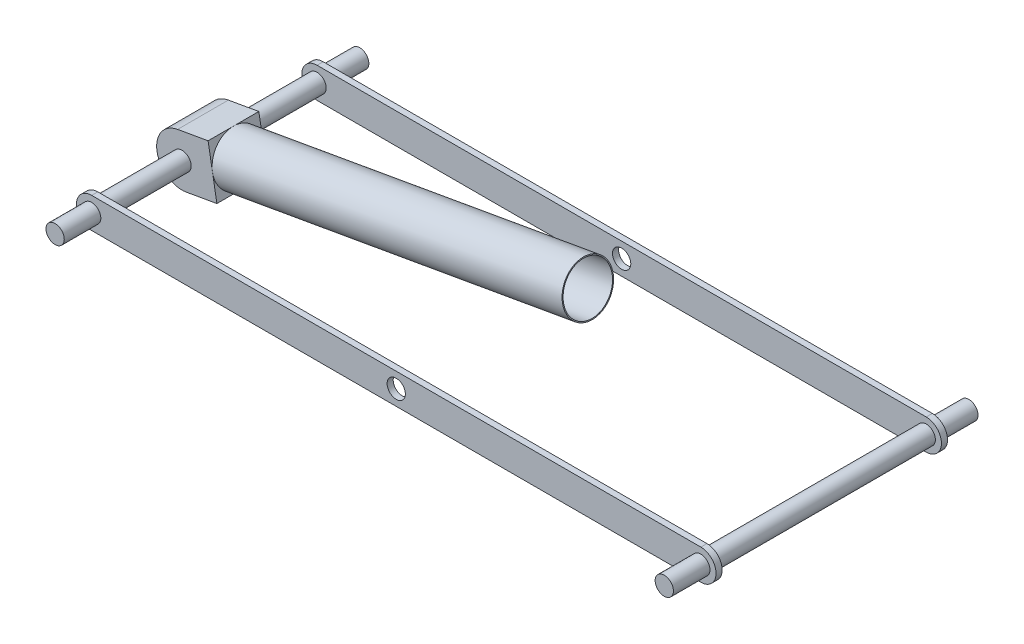
ISO-10303-21;
HEADER;
FILE_DESCRIPTION(('STEP AP214'),'2;1');
FILE_NAME('part.step','',(''),(''),'','','');
FILE_SCHEMA(('AUTOMOTIVE_DESIGN { 1 0 10303 214 1 1 1 1 }'));
ENDSEC;
DATA;
#1=APPLICATION_CONTEXT('core data for automotive mechanical design processes');
#2=APPLICATION_PROTOCOL_DEFINITION('international standard','automotive_design',2000,#1);
#3=PRODUCT_CONTEXT('',#1,'mechanical');
#4=PRODUCT('Part','Part','',(#3));
#5=PRODUCT_RELATED_PRODUCT_CATEGORY('part','',(#4));
#6=PRODUCT_DEFINITION_FORMATION('','',#4);
#7=PRODUCT_DEFINITION_CONTEXT('part definition',#1,'design');
#8=PRODUCT_DEFINITION('design','',#6,#7);
#9=PRODUCT_DEFINITION_SHAPE('','',#8);
#10=(LENGTH_UNIT() NAMED_UNIT(*) SI_UNIT(.MILLI.,.METRE.));
#11=(NAMED_UNIT(*) PLANE_ANGLE_UNIT() SI_UNIT($,.RADIAN.));
#12=(NAMED_UNIT(*) SI_UNIT($,.STERADIAN.) SOLID_ANGLE_UNIT());
#13=UNCERTAINTY_MEASURE_WITH_UNIT(LENGTH_MEASURE(1.E-05),#10,'distance_accuracy_value','');
#14=(GEOMETRIC_REPRESENTATION_CONTEXT(3) GLOBAL_UNCERTAINTY_ASSIGNED_CONTEXT((#13)) GLOBAL_UNIT_ASSIGNED_CONTEXT((#10,
#11,#12)) REPRESENTATION_CONTEXT('',''));
#15=CARTESIAN_POINT('',(0.,0.,0.));
#16=DIRECTION('',(0.,0.,1.));
#17=DIRECTION('',(1.,0.,0.));
#18=AXIS2_PLACEMENT_3D('',#15,#16,#17);
#19=CARTESIAN_POINT('',(0.,0.,114.));
#20=DIRECTION('',(0.,0.,-1.));
#21=DIRECTION('',(-1.,0.,0.));
#22=AXIS2_PLACEMENT_3D('',#19,#20,#21);
#23=CYLINDRICAL_SURFACE('',#22,15.);
#24=CARTESIAN_POINT('',(0.,0.,108.));
#25=DIRECTION('',(0.,0.,1.));
#26=DIRECTION('',(1.,0.,0.));
#27=AXIS2_PLACEMENT_3D('',#24,#25,#26);
#28=CIRCLE('',#27,15.);
#29=CARTESIAN_POINT('',(0.,15.,108.));
#30=VERTEX_POINT('',#29);
#31=CARTESIAN_POINT('',(0.,-15.,108.));
#32=VERTEX_POINT('',#31);
#33=EDGE_CURVE('E118',#30,#32,#28,.T.);
#34=ORIENTED_EDGE('',*,*,#33,.T.);
#35=DIRECTION('',(0.,0.,-1.));
#36=VECTOR('',#35,1.);
#37=CARTESIAN_POINT('',(0.,-15.,114.));
#38=LINE('',#37,#36);
#39=CARTESIAN_POINT('',(0.,-15.,114.));
#40=VERTEX_POINT('',#39);
#41=EDGE_CURVE('E12',#40,#32,#38,.T.);
#42=ORIENTED_EDGE('',*,*,#41,.F.);
#43=CARTESIAN_POINT('',(0.,0.,114.));
#44=DIRECTION('',(0.,0.,1.));
#45=DIRECTION('',(1.,0.,0.));
#46=AXIS2_PLACEMENT_3D('',#43,#44,#45);
#47=CIRCLE('',#46,15.);
#48=CARTESIAN_POINT('',(0.,15.,114.));
#49=VERTEX_POINT('',#48);
#50=EDGE_CURVE('E106',#49,#40,#47,.T.);
#51=ORIENTED_EDGE('',*,*,#50,.F.);
#52=DIRECTION('',(0.,0.,-1.));
#53=VECTOR('',#52,1.);
#54=CARTESIAN_POINT('',(0.,15.,114.));
#55=LINE('',#54,#53);
#56=EDGE_CURVE('E114',#49,#30,#55,.T.);
#57=ORIENTED_EDGE('',*,*,#56,.T.);
#58=EDGE_LOOP('',(#34,#42,#51,#57));
#59=FACE_BOUND('',#58,.T.);
#60=ADVANCED_FACE('F53',(#59),#23,.T.);
#61=CARTESIAN_POINT('',(600.,-15.,114.));
#62=DIRECTION('',(0.,1.,0.));
#63=DIRECTION('',(0.,0.,1.));
#64=AXIS2_PLACEMENT_3D('',#61,#62,#63);
#65=PLANE('',#64);
#66=DIRECTION('',(1.,0.,0.));
#67=VECTOR('',#66,1.);
#68=CARTESIAN_POINT('',(600.,-15.,108.));
#69=LINE('',#68,#67);
#70=CARTESIAN_POINT('',(600.,-15.,108.));
#71=VERTEX_POINT('',#70);
#72=EDGE_CURVE('E109',#32,#71,#69,.T.);
#73=ORIENTED_EDGE('',*,*,#72,.T.);
#74=DIRECTION('',(0.,0.,-1.));
#75=VECTOR('',#74,1.);
#76=CARTESIAN_POINT('',(600.,-15.,114.));
#77=LINE('',#76,#75);
#78=CARTESIAN_POINT('',(600.,-15.,114.));
#79=VERTEX_POINT('',#78);
#80=EDGE_CURVE('E64',#79,#71,#77,.T.);
#81=ORIENTED_EDGE('',*,*,#80,.F.);
#82=DIRECTION('',(1.,0.,0.));
#83=VECTOR('',#82,1.);
#84=CARTESIAN_POINT('',(600.,-15.,114.));
#85=LINE('',#84,#83);
#86=EDGE_CURVE('E103',#40,#79,#85,.T.);
#87=ORIENTED_EDGE('',*,*,#86,.F.);
#88=ORIENTED_EDGE('',*,*,#41,.T.);
#89=EDGE_LOOP('',(#73,#81,#87,#88));
#90=FACE_BOUND('',#89,.T.);
#91=ADVANCED_FACE('F107',(#90),#65,.F.);
#92=CARTESIAN_POINT('',(600.,0.,114.));
#93=DIRECTION('',(0.,0.,-1.));
#94=DIRECTION('',(-1.,0.,0.));
#95=AXIS2_PLACEMENT_3D('',#92,#93,#94);
#96=CYLINDRICAL_SURFACE('',#95,15.);
#97=CARTESIAN_POINT('',(600.,0.,108.));
#98=DIRECTION('',(0.,0.,1.));
#99=DIRECTION('',(1.,0.,0.));
#100=AXIS2_PLACEMENT_3D('',#97,#98,#99);
#101=CIRCLE('',#100,15.);
#102=CARTESIAN_POINT('',(600.,15.,108.));
#103=VERTEX_POINT('',#102);
#104=EDGE_CURVE('E89',#71,#103,#101,.T.);
#105=ORIENTED_EDGE('',*,*,#104,.T.);
#106=DIRECTION('',(0.,0.,-1.));
#107=VECTOR('',#106,1.);
#108=CARTESIAN_POINT('',(600.,15.,114.));
#109=LINE('',#108,#107);
#110=CARTESIAN_POINT('',(600.,15.,114.));
#111=VERTEX_POINT('',#110);
#112=EDGE_CURVE('E111',#111,#103,#109,.T.);
#113=ORIENTED_EDGE('',*,*,#112,.F.);
#114=CARTESIAN_POINT('',(600.,0.,114.));
#115=DIRECTION('',(0.,0.,1.));
#116=DIRECTION('',(1.,0.,0.));
#117=AXIS2_PLACEMENT_3D('',#114,#115,#116);
#118=CIRCLE('',#117,15.);
#119=EDGE_CURVE('E104',#79,#111,#118,.T.);
#120=ORIENTED_EDGE('',*,*,#119,.F.);
#121=ORIENTED_EDGE('',*,*,#80,.T.);
#122=EDGE_LOOP('',(#105,#113,#120,#121));
#123=FACE_BOUND('',#122,.T.);
#124=ADVANCED_FACE('F113',(#123),#96,.T.);
#125=CARTESIAN_POINT('',(0.,15.,114.));
#126=DIRECTION('',(0.,-1.,0.));
#127=DIRECTION('',(1.,0.,0.));
#128=AXIS2_PLACEMENT_3D('',#125,#126,#127);
#129=PLANE('',#128);
#130=DIRECTION('',(-1.,0.,0.));
#131=VECTOR('',#130,1.);
#132=CARTESIAN_POINT('',(0.,15.,108.));
#133=LINE('',#132,#131);
#134=EDGE_CURVE('E93',#103,#30,#133,.T.);
#135=ORIENTED_EDGE('',*,*,#134,.T.);
#136=ORIENTED_EDGE('',*,*,#56,.F.);
#137=DIRECTION('',(-1.,0.,0.));
#138=VECTOR('',#137,1.);
#139=CARTESIAN_POINT('',(0.,15.,114.));
#140=LINE('',#139,#138);
#141=EDGE_CURVE('E71',#111,#49,#140,.T.);
#142=ORIENTED_EDGE('',*,*,#141,.F.);
#143=ORIENTED_EDGE('',*,*,#112,.T.);
#144=EDGE_LOOP('',(#135,#136,#142,#143));
#145=FACE_BOUND('',#144,.T.);
#146=ADVANCED_FACE('F130',(#145),#129,.F.);
#147=CARTESIAN_POINT('',(0.,0.,114.));
#148=DIRECTION('',(0.,0.,1.));
#149=DIRECTION('',(1.,0.,0.));
#150=AXIS2_PLACEMENT_3D('',#147,#148,#149);
#151=PLANE('',#150);
#152=CARTESIAN_POINT('',(300.,0.,114.));
#153=DIRECTION('',(0.,0.,1.));
#154=DIRECTION('',(1.,0.,0.));
#155=AXIS2_PLACEMENT_3D('',#152,#153,#154);
#156=CIRCLE('',#155,9.00000000000001);
#157=CARTESIAN_POINT('',(309.,0.,114.));
#158=VERTEX_POINT('',#157);
#159=EDGE_CURVE('E125',#158,#158,#156,.T.);
#160=ORIENTED_EDGE('',*,*,#159,.F.);
#161=EDGE_LOOP('',(#160));
#162=FACE_BOUND('',#161,.T.);
#163=ORIENTED_EDGE('',*,*,#50,.T.);
#164=ORIENTED_EDGE('',*,*,#86,.T.);
#165=ORIENTED_EDGE('',*,*,#119,.T.);
#166=ORIENTED_EDGE('',*,*,#141,.T.);
#167=EDGE_LOOP('',(#163,#164,#165,#166));
#168=FACE_BOUND('',#167,.T.);
#169=ADVANCED_FACE('F105',(#162,#168),#151,.T.);
#170=CARTESIAN_POINT('',(0.,0.,108.));
#171=DIRECTION('',(0.,0.,1.));
#172=DIRECTION('',(1.,0.,0.));
#173=AXIS2_PLACEMENT_3D('',#170,#171,#172);
#174=PLANE('',#173);
#175=CARTESIAN_POINT('',(300.,0.,108.));
#176=DIRECTION('',(0.,0.,1.));
#177=DIRECTION('',(1.,0.,0.));
#178=AXIS2_PLACEMENT_3D('',#175,#176,#177);
#179=CIRCLE('',#178,9.00000000000001);
#180=CARTESIAN_POINT('',(309.,0.,108.));
#181=VERTEX_POINT('',#180);
#182=EDGE_CURVE('E60',#181,#181,#179,.T.);
#183=ORIENTED_EDGE('',*,*,#182,.T.);
#184=EDGE_LOOP('',(#183));
#185=FACE_BOUND('',#184,.T.);
#186=ORIENTED_EDGE('',*,*,#33,.F.);
#187=ORIENTED_EDGE('',*,*,#134,.F.);
#188=ORIENTED_EDGE('',*,*,#104,.F.);
#189=ORIENTED_EDGE('',*,*,#72,.F.);
#190=EDGE_LOOP('',(#186,#187,#188,#189));
#191=FACE_BOUND('',#190,.T.);
#192=ADVANCED_FACE('F128',(#185,#191),#174,.F.);
#193=CARTESIAN_POINT('',(300.,0.,-150.));
#194=DIRECTION('',(0.,0.,1.));
#195=DIRECTION('',(1.,0.,0.));
#196=AXIS2_PLACEMENT_3D('',#193,#194,#195);
#197=CYLINDRICAL_SURFACE('',#196,9.00000000000001);
#198=ORIENTED_EDGE('',*,*,#159,.T.);
#199=EDGE_LOOP('',(#198));
#200=FACE_BOUND('',#199,.T.);
#201=ORIENTED_EDGE('',*,*,#182,.F.);
#202=EDGE_LOOP('',(#201));
#203=FACE_BOUND('',#202,.T.);
#204=ADVANCED_FACE('F140',(#200,#203),#197,.F.);
#205=CLOSED_SHELL('',(#60,#91,#124,#146,#169,#192,#204));
#206=MANIFOLD_SOLID_BREP('B2',#205);
#207=CARTESIAN_POINT('',(0.,0.,150.));
#208=DIRECTION('',(0.,0.,-1.));
#209=DIRECTION('',(-1.,0.,0.));
#210=AXIS2_PLACEMENT_3D('',#207,#208,#209);
#211=CYLINDRICAL_SURFACE('',#210,9.);
#212=CARTESIAN_POINT('',(0.,0.,150.));
#213=DIRECTION('',(0.,0.,1.));
#214=DIRECTION('',(1.,0.,0.));
#215=AXIS2_PLACEMENT_3D('',#212,#213,#214);
#216=CIRCLE('',#215,9.);
#217=CARTESIAN_POINT('',(9.,0.,150.));
#218=VERTEX_POINT('',#217);
#219=EDGE_CURVE('E52',#218,#218,#216,.T.);
#220=ORIENTED_EDGE('',*,*,#219,.F.);
#221=EDGE_LOOP('',(#220));
#222=FACE_BOUND('',#221,.T.);
#223=CARTESIAN_POINT('',(0.,0.,-150.));
#224=DIRECTION('',(0.,0.,1.));
#225=DIRECTION('',(1.,0.,0.));
#226=AXIS2_PLACEMENT_3D('',#223,#224,#225);
#227=CIRCLE('',#226,9.);
#228=CARTESIAN_POINT('',(9.,0.,-150.));
#229=VERTEX_POINT('',#228);
#230=EDGE_CURVE('E222',#229,#229,#227,.T.);
#231=ORIENTED_EDGE('',*,*,#230,.T.);
#232=EDGE_LOOP('',(#231));
#233=FACE_BOUND('',#232,.T.);
#234=ADVANCED_FACE('F216',(#222,#233),#211,.T.);
#235=CARTESIAN_POINT('',(0.,0.,150.));
#236=DIRECTION('',(0.,0.,1.));
#237=DIRECTION('',(1.,0.,0.));
#238=AXIS2_PLACEMENT_3D('',#235,#236,#237);
#239=PLANE('',#238);
#240=ORIENTED_EDGE('',*,*,#219,.T.);
#241=EDGE_LOOP('',(#240));
#242=FACE_BOUND('',#241,.T.);
#243=ADVANCED_FACE('F234',(#242),#239,.T.);
#244=CARTESIAN_POINT('',(0.,0.,-150.));
#245=DIRECTION('',(0.,0.,1.));
#246=DIRECTION('',(1.,0.,0.));
#247=AXIS2_PLACEMENT_3D('',#244,#245,#246);
#248=PLANE('',#247);
#249=ORIENTED_EDGE('',*,*,#230,.F.);
#250=EDGE_LOOP('',(#249));
#251=FACE_BOUND('',#250,.T.);
#252=ADVANCED_FACE('F235',(#251),#248,.F.);
#253=CLOSED_SHELL('',(#234,#243,#252));
#254=MANIFOLD_SOLID_BREP('B6',#253);
#255=CARTESIAN_POINT('',(0.,0.,-114.));
#256=DIRECTION('',(0.,0.,1.));
#257=DIRECTION('',(-1.,0.,0.));
#258=AXIS2_PLACEMENT_3D('',#255,#256,#257);
#259=CYLINDRICAL_SURFACE('',#258,15.);
#260=CARTESIAN_POINT('',(0.,0.,-108.));
#261=DIRECTION('',(0.,0.,1.));
#262=DIRECTION('',(1.,0.,0.));
#263=AXIS2_PLACEMENT_3D('',#260,#261,#262);
#264=CIRCLE('',#263,15.);
#265=CARTESIAN_POINT('',(0.,15.,-108.));
#266=VERTEX_POINT('',#265);
#267=CARTESIAN_POINT('',(0.,-15.,-108.));
#268=VERTEX_POINT('',#267);
#269=EDGE_CURVE('E333',#266,#268,#264,.T.);
#270=ORIENTED_EDGE('',*,*,#269,.F.);
#271=DIRECTION('',(0.,0.,1.));
#272=VECTOR('',#271,1.);
#273=CARTESIAN_POINT('',(0.,15.,-114.));
#274=LINE('',#273,#272);
#275=CARTESIAN_POINT('',(0.,15.,-114.));
#276=VERTEX_POINT('',#275);
#277=EDGE_CURVE('E334',#276,#266,#274,.T.);
#278=ORIENTED_EDGE('',*,*,#277,.F.);
#279=CARTESIAN_POINT('',(0.,0.,-114.));
#280=DIRECTION('',(0.,0.,1.));
#281=DIRECTION('',(1.,0.,0.));
#282=AXIS2_PLACEMENT_3D('',#279,#280,#281);
#283=CIRCLE('',#282,15.);
#284=CARTESIAN_POINT('',(0.,-15.,-114.));
#285=VERTEX_POINT('',#284);
#286=EDGE_CURVE('E330',#276,#285,#283,.T.);
#287=ORIENTED_EDGE('',*,*,#286,.T.);
#288=DIRECTION('',(0.,0.,1.));
#289=VECTOR('',#288,1.);
#290=CARTESIAN_POINT('',(0.,-15.,-114.));
#291=LINE('',#290,#289);
#292=EDGE_CURVE('E220',#285,#268,#291,.T.);
#293=ORIENTED_EDGE('',*,*,#292,.T.);
#294=EDGE_LOOP('',(#270,#278,#287,#293));
#295=FACE_BOUND('',#294,.T.);
#296=ADVANCED_FACE('F269',(#295),#259,.T.);
#297=CARTESIAN_POINT('',(600.,-15.,-114.));
#298=DIRECTION('',(0.,1.,0.));
#299=DIRECTION('',(0.,0.,-1.));
#300=AXIS2_PLACEMENT_3D('',#297,#298,#299);
#301=PLANE('',#300);
#302=DIRECTION('',(1.,0.,0.));
#303=VECTOR('',#302,1.);
#304=CARTESIAN_POINT('',(600.,-15.,-108.));
#305=LINE('',#304,#303);
#306=CARTESIAN_POINT('',(600.,-15.,-108.));
#307=VERTEX_POINT('',#306);
#308=EDGE_CURVE('E337',#268,#307,#305,.T.);
#309=ORIENTED_EDGE('',*,*,#308,.F.);
#310=ORIENTED_EDGE('',*,*,#292,.F.);
#311=DIRECTION('',(1.,0.,0.));
#312=VECTOR('',#311,1.);
#313=CARTESIAN_POINT('',(600.,-15.,-114.));
#314=LINE('',#313,#312);
#315=CARTESIAN_POINT('',(600.,-15.,-114.));
#316=VERTEX_POINT('',#315);
#317=EDGE_CURVE('E309',#285,#316,#314,.T.);
#318=ORIENTED_EDGE('',*,*,#317,.T.);
#319=DIRECTION('',(0.,0.,1.));
#320=VECTOR('',#319,1.);
#321=CARTESIAN_POINT('',(600.,-15.,-114.));
#322=LINE('',#321,#320);
#323=EDGE_CURVE('E280',#316,#307,#322,.T.);
#324=ORIENTED_EDGE('',*,*,#323,.T.);
#325=EDGE_LOOP('',(#309,#310,#318,#324));
#326=FACE_BOUND('',#325,.T.);
#327=ADVANCED_FACE('F323',(#326),#301,.F.);
#328=CARTESIAN_POINT('',(600.,0.,-114.));
#329=DIRECTION('',(0.,0.,1.));
#330=DIRECTION('',(-1.,0.,0.));
#331=AXIS2_PLACEMENT_3D('',#328,#329,#330);
#332=CYLINDRICAL_SURFACE('',#331,15.);
#333=CARTESIAN_POINT('',(600.,0.,-108.));
#334=DIRECTION('',(0.,0.,1.));
#335=DIRECTION('',(1.,0.,0.));
#336=AXIS2_PLACEMENT_3D('',#333,#334,#335);
#337=CIRCLE('',#336,15.);
#338=CARTESIAN_POINT('',(600.,15.,-108.));
#339=VERTEX_POINT('',#338);
#340=EDGE_CURVE('E318',#307,#339,#337,.T.);
#341=ORIENTED_EDGE('',*,*,#340,.F.);
#342=ORIENTED_EDGE('',*,*,#323,.F.);
#343=CARTESIAN_POINT('',(600.,0.,-114.));
#344=DIRECTION('',(0.,0.,1.));
#345=DIRECTION('',(1.,0.,0.));
#346=AXIS2_PLACEMENT_3D('',#343,#344,#345);
#347=CIRCLE('',#346,15.);
#348=CARTESIAN_POINT('',(600.,15.,-114.));
#349=VERTEX_POINT('',#348);
#350=EDGE_CURVE('E312',#316,#349,#347,.T.);
#351=ORIENTED_EDGE('',*,*,#350,.T.);
#352=DIRECTION('',(0.,0.,1.));
#353=VECTOR('',#352,1.);
#354=CARTESIAN_POINT('',(600.,15.,-114.));
#355=LINE('',#354,#353);
#356=EDGE_CURVE('E324',#349,#339,#355,.T.);
#357=ORIENTED_EDGE('',*,*,#356,.T.);
#358=EDGE_LOOP('',(#341,#342,#351,#357));
#359=FACE_BOUND('',#358,.T.);
#360=ADVANCED_FACE('F316',(#359),#332,.T.);
#361=CARTESIAN_POINT('',(0.,15.,-114.));
#362=DIRECTION('',(0.,-1.,0.));
#363=DIRECTION('',(1.,0.,0.));
#364=AXIS2_PLACEMENT_3D('',#361,#362,#363);
#365=PLANE('',#364);
#366=DIRECTION('',(-1.,0.,0.));
#367=VECTOR('',#366,1.);
#368=CARTESIAN_POINT('',(0.,15.,-108.));
#369=LINE('',#368,#367);
#370=EDGE_CURVE('E299',#339,#266,#369,.T.);
#371=ORIENTED_EDGE('',*,*,#370,.F.);
#372=ORIENTED_EDGE('',*,*,#356,.F.);
#373=DIRECTION('',(-1.,0.,0.));
#374=VECTOR('',#373,1.);
#375=CARTESIAN_POINT('',(0.,15.,-114.));
#376=LINE('',#375,#374);
#377=EDGE_CURVE('E283',#349,#276,#376,.T.);
#378=ORIENTED_EDGE('',*,*,#377,.T.);
#379=ORIENTED_EDGE('',*,*,#277,.T.);
#380=EDGE_LOOP('',(#371,#372,#378,#379));
#381=FACE_BOUND('',#380,.T.);
#382=ADVANCED_FACE('F347',(#381),#365,.F.);
#383=CARTESIAN_POINT('',(0.,0.,-114.));
#384=DIRECTION('',(0.,0.,-1.));
#385=DIRECTION('',(1.,0.,0.));
#386=AXIS2_PLACEMENT_3D('',#383,#384,#385);
#387=PLANE('',#386);
#388=CARTESIAN_POINT('',(300.,0.,-114.));
#389=DIRECTION('',(0.,0.,-1.));
#390=DIRECTION('',(-1.,0.,0.));
#391=AXIS2_PLACEMENT_3D('',#388,#389,#390);
#392=CIRCLE('',#391,9.00000000000001);
#393=CARTESIAN_POINT('',(291.,0.,-114.));
#394=VERTEX_POINT('',#393);
#395=EDGE_CURVE('E340',#394,#394,#392,.T.);
#396=ORIENTED_EDGE('',*,*,#395,.F.);
#397=EDGE_LOOP('',(#396));
#398=FACE_BOUND('',#397,.T.);
#399=ORIENTED_EDGE('',*,*,#286,.F.);
#400=ORIENTED_EDGE('',*,*,#377,.F.);
#401=ORIENTED_EDGE('',*,*,#350,.F.);
#402=ORIENTED_EDGE('',*,*,#317,.F.);
#403=EDGE_LOOP('',(#399,#400,#401,#402));
#404=FACE_BOUND('',#403,.T.);
#405=ADVANCED_FACE('F314',(#398,#404),#387,.T.);
#406=CARTESIAN_POINT('',(0.,0.,-108.));
#407=DIRECTION('',(0.,0.,-1.));
#408=DIRECTION('',(1.,0.,0.));
#409=AXIS2_PLACEMENT_3D('',#406,#407,#408);
#410=PLANE('',#409);
#411=CARTESIAN_POINT('',(300.,0.,-108.));
#412=DIRECTION('',(0.,0.,-1.));
#413=DIRECTION('',(-1.,0.,0.));
#414=AXIS2_PLACEMENT_3D('',#411,#412,#413);
#415=CIRCLE('',#414,9.00000000000001);
#416=CARTESIAN_POINT('',(291.,0.,-108.));
#417=VERTEX_POINT('',#416);
#418=EDGE_CURVE('E272',#417,#417,#415,.T.);
#419=ORIENTED_EDGE('',*,*,#418,.T.);
#420=EDGE_LOOP('',(#419));
#421=FACE_BOUND('',#420,.T.);
#422=ORIENTED_EDGE('',*,*,#269,.T.);
#423=ORIENTED_EDGE('',*,*,#308,.T.);
#424=ORIENTED_EDGE('',*,*,#340,.T.);
#425=ORIENTED_EDGE('',*,*,#370,.T.);
#426=EDGE_LOOP('',(#422,#423,#424,#425));
#427=FACE_BOUND('',#426,.T.);
#428=ADVANCED_FACE('F345',(#421,#427),#410,.F.);
#429=CARTESIAN_POINT('',(300.,0.,-150.));
#430=DIRECTION('',(0.,0.,1.));
#431=DIRECTION('',(1.,0.,0.));
#432=AXIS2_PLACEMENT_3D('',#429,#430,#431);
#433=CYLINDRICAL_SURFACE('',#432,9.00000000000001);
#434=ORIENTED_EDGE('',*,*,#395,.T.);
#435=EDGE_LOOP('',(#434));
#436=FACE_BOUND('',#435,.T.);
#437=ORIENTED_EDGE('',*,*,#418,.F.);
#438=EDGE_LOOP('',(#437));
#439=FACE_BOUND('',#438,.T.);
#440=ADVANCED_FACE('F382',(#436,#439),#433,.F.);
#441=CLOSED_SHELL('',(#296,#327,#360,#382,#405,#428,#440));
#442=MANIFOLD_SOLID_BREP('B48',#441);
#443=CARTESIAN_POINT('',(600.,0.,150.));
#444=DIRECTION('',(0.,0.,-1.));
#445=DIRECTION('',(-1.,0.,0.));
#446=AXIS2_PLACEMENT_3D('',#443,#444,#445);
#447=CYLINDRICAL_SURFACE('',#446,8.99999999999994);
#448=CARTESIAN_POINT('',(600.,0.,150.));
#449=DIRECTION('',(0.,0.,1.));
#450=DIRECTION('',(1.,0.,0.));
#451=AXIS2_PLACEMENT_3D('',#448,#449,#450);
#452=CIRCLE('',#451,8.99999999999994);
#453=CARTESIAN_POINT('',(609.,0.,150.));
#454=VERTEX_POINT('',#453);
#455=EDGE_CURVE('E267',#454,#454,#452,.T.);
#456=ORIENTED_EDGE('',*,*,#455,.F.);
#457=EDGE_LOOP('',(#456));
#458=FACE_BOUND('',#457,.T.);
#459=CARTESIAN_POINT('',(600.,0.,-150.));
#460=DIRECTION('',(0.,0.,1.));
#461=DIRECTION('',(1.,0.,0.));
#462=AXIS2_PLACEMENT_3D('',#459,#460,#461);
#463=CIRCLE('',#462,8.99999999999994);
#464=CARTESIAN_POINT('',(609.,0.,-150.));
#465=VERTEX_POINT('',#464);
#466=EDGE_CURVE('E432',#465,#465,#463,.T.);
#467=ORIENTED_EDGE('',*,*,#466,.T.);
#468=EDGE_LOOP('',(#467));
#469=FACE_BOUND('',#468,.T.);
#470=ADVANCED_FACE('F431',(#458,#469),#447,.T.);
#471=CARTESIAN_POINT('',(600.,0.,150.));
#472=DIRECTION('',(0.,0.,1.));
#473=DIRECTION('',(1.,0.,0.));
#474=AXIS2_PLACEMENT_3D('',#471,#472,#473);
#475=PLANE('',#474);
#476=ORIENTED_EDGE('',*,*,#455,.T.);
#477=EDGE_LOOP('',(#476));
#478=FACE_BOUND('',#477,.T.);
#479=ADVANCED_FACE('F447',(#478),#475,.T.);
#480=CARTESIAN_POINT('',(600.,0.,-150.));
#481=DIRECTION('',(0.,0.,1.));
#482=DIRECTION('',(1.,0.,0.));
#483=AXIS2_PLACEMENT_3D('',#480,#481,#482);
#484=PLANE('',#483);
#485=ORIENTED_EDGE('',*,*,#466,.F.);
#486=EDGE_LOOP('',(#485));
#487=FACE_BOUND('',#486,.T.);
#488=ADVANCED_FACE('F443',(#487),#484,.F.);
#489=CLOSED_SHELL('',(#470,#479,#488));
#490=MANIFOLD_SOLID_BREP('B212',#489);
#491=CARTESIAN_POINT('',(374.682713554273,66.0666716046799,0.));
#492=DIRECTION('',(0.984807753012208,0.173648177666931,0.));
#493=DIRECTION('',(-0.173648177666931,0.984807753012208,0.));
#494=AXIS2_PLACEMENT_3D('',#491,#492,#493);
#495=PLANE('',#494);
#496=CARTESIAN_POINT('',(374.682713554273,66.0666716046799,0.));
#497=DIRECTION('',(0.984807753012208,0.173648177666931,0.));
#498=DIRECTION('',(-0.173648177666931,0.984807753012208,0.));
#499=AXIS2_PLACEMENT_3D('',#496,#497,#498);
#500=CIRCLE('',#499,25.);
#501=CARTESIAN_POINT('',(370.341509112599,90.6868654299851,0.));
#502=VERTEX_POINT('',#501);
#503=EDGE_CURVE('E427',#502,#502,#500,.T.);
#504=ORIENTED_EDGE('',*,*,#503,.T.);
#505=EDGE_LOOP('',(#504));
#506=FACE_BOUND('',#505,.T.);
#507=CARTESIAN_POINT('',(374.682713554273,66.0666716046799,0.));
#508=DIRECTION('',(0.984807753012208,0.173648177666931,0.));
#509=DIRECTION('',(-0.173648177666931,0.984807753012208,0.));
#510=AXIS2_PLACEMENT_3D('',#507,#508,#509);
#511=CIRCLE('',#510,24.);
#512=CARTESIAN_POINT('',(370.515157290266,89.7020576769729,0.));
#513=VERTEX_POINT('',#512);
#514=EDGE_CURVE('E488',#513,#513,#511,.T.);
#515=ORIENTED_EDGE('',*,*,#514,.F.);
#516=EDGE_LOOP('',(#515));
#517=FACE_BOUND('',#516,.T.);
#518=ADVANCED_FACE('F473',(#506,#517),#495,.T.);
#519=CARTESIAN_POINT('',(30.,5.28980942125397,0.));
#520=DIRECTION('',(0.984807753012208,0.173648177666931,0.));
#521=DIRECTION('',(-0.173648177666931,0.984807753012208,0.));
#522=AXIS2_PLACEMENT_3D('',#519,#520,#521);
#523=PLANE('',#522);
#524=CARTESIAN_POINT('',(30.,5.28980942125397,0.));
#525=DIRECTION('',(0.984807753012208,0.173648177666931,0.));
#526=DIRECTION('',(-0.173648177666931,0.984807753012208,0.));
#527=AXIS2_PLACEMENT_3D('',#524,#525,#526);
#528=CIRCLE('',#527,25.);
#529=CARTESIAN_POINT('',(25.6587955583267,29.9100032465592,0.));
#530=VERTEX_POINT('',#529);
#531=EDGE_CURVE('E476',#530,#530,#528,.T.);
#532=ORIENTED_EDGE('',*,*,#531,.F.);
#533=EDGE_LOOP('',(#532));
#534=FACE_BOUND('',#533,.T.);
#535=CARTESIAN_POINT('',(30.,5.28980942125397,0.));
#536=DIRECTION('',(0.984807753012208,0.173648177666931,0.));
#537=DIRECTION('',(-0.173648177666931,0.984807753012208,0.));
#538=AXIS2_PLACEMENT_3D('',#535,#536,#537);
#539=CIRCLE('',#538,24.);
#540=CARTESIAN_POINT('',(25.8324437359936,28.925195493547,0.));
#541=VERTEX_POINT('',#540);
#542=EDGE_CURVE('E486',#541,#541,#539,.T.);
#543=ORIENTED_EDGE('',*,*,#542,.T.);
#544=EDGE_LOOP('',(#543));
#545=FACE_BOUND('',#544,.T.);
#546=ADVANCED_FACE('F498',(#534,#545),#523,.F.);
#547=CARTESIAN_POINT('',(374.682713554273,66.0666716046799,0.));
#548=DIRECTION('',(-0.984807753012208,-0.173648177666931,0.));
#549=DIRECTION('',(0.173648177666931,-0.984807753012208,0.));
#550=AXIS2_PLACEMENT_3D('',#547,#548,#549);
#551=CYLINDRICAL_SURFACE('',#550,25.);
#552=ORIENTED_EDGE('',*,*,#503,.F.);
#553=EDGE_LOOP('',(#552));
#554=FACE_BOUND('',#553,.T.);
#555=ORIENTED_EDGE('',*,*,#531,.T.);
#556=EDGE_LOOP('',(#555));
#557=FACE_BOUND('',#556,.T.);
#558=ADVANCED_FACE('F480',(#554,#557),#551,.T.);
#559=CARTESIAN_POINT('',(374.682713554273,66.0666716046799,0.));
#560=DIRECTION('',(-0.984807753012208,-0.173648177666931,0.));
#561=DIRECTION('',(0.173648177666931,-0.984807753012208,0.));
#562=AXIS2_PLACEMENT_3D('',#559,#560,#561);
#563=CYLINDRICAL_SURFACE('',#562,24.);
#564=ORIENTED_EDGE('',*,*,#514,.T.);
#565=EDGE_LOOP('',(#564));
#566=FACE_BOUND('',#565,.T.);
#567=ORIENTED_EDGE('',*,*,#542,.F.);
#568=EDGE_LOOP('',(#567));
#569=FACE_BOUND('',#568,.T.);
#570=ADVANCED_FACE('F494',(#566,#569),#563,.F.);
#571=CLOSED_SHELL('',(#518,#546,#558,#570));
#572=MANIFOLD_SOLID_BREP('B265_NOT_SHOWN',#571);
#573=CARTESIAN_POINT('',(0.,0.,25.));
#574=DIRECTION('',(0.,0.,-1.));
#575=DIRECTION('',(-1.,0.,0.));
#576=AXIS2_PLACEMENT_3D('',#573,#574,#575);
#577=CYLINDRICAL_SURFACE('',#576,25.);
#578=CARTESIAN_POINT('',(0.,0.,-25.));
#579=DIRECTION('',(0.,0.,1.));
#580=DIRECTION('',(1.,0.,0.));
#581=AXIS2_PLACEMENT_3D('',#578,#579,#580);
#582=CIRCLE('',#581,25.);
#583=CARTESIAN_POINT('',(-4.34120444167328,24.6201938253052,-25.));
#584=VERTEX_POINT('',#583);
#585=CARTESIAN_POINT('',(4.34120444167328,-24.6201938253052,-25.));
#586=VERTEX_POINT('',#585);
#587=EDGE_CURVE('E592',#584,#586,#582,.T.);
#588=ORIENTED_EDGE('',*,*,#587,.T.);
#589=DIRECTION('',(0.,0.,-1.));
#590=VECTOR('',#589,1.);
#591=CARTESIAN_POINT('',(4.34120444167328,-24.6201938253052,25.));
#592=LINE('',#591,#590);
#593=CARTESIAN_POINT('',(4.34120444167328,-24.6201938253052,25.));
#594=VERTEX_POINT('',#593);
#595=EDGE_CURVE('E474',#594,#586,#592,.T.);
#596=ORIENTED_EDGE('',*,*,#595,.F.);
#597=CARTESIAN_POINT('',(0.,0.,25.));
#598=DIRECTION('',(0.,0.,1.));
#599=DIRECTION('',(1.,0.,0.));
#600=AXIS2_PLACEMENT_3D('',#597,#598,#599);
#601=CIRCLE('',#600,25.);
#602=CARTESIAN_POINT('',(-4.34120444167328,24.6201938253052,25.));
#603=VERTEX_POINT('',#602);
#604=EDGE_CURVE('E578',#603,#594,#601,.T.);
#605=ORIENTED_EDGE('',*,*,#604,.F.);
#606=DIRECTION('',(0.,0.,-1.));
#607=VECTOR('',#606,1.);
#608=CARTESIAN_POINT('',(-4.34120444167328,24.6201938253052,25.));
#609=LINE('',#608,#607);
#610=EDGE_CURVE('E589',#603,#584,#609,.T.);
#611=ORIENTED_EDGE('',*,*,#610,.T.);
#612=EDGE_LOOP('',(#588,#596,#605,#611));
#613=FACE_BOUND('',#612,.T.);
#614=ADVANCED_FACE('F528',(#613),#577,.T.);
#615=CARTESIAN_POINT('',(4.34120444167328,-24.6201938253052,25.));
#616=DIRECTION('',(-0.173648177666931,0.984807753012208,0.));
#617=DIRECTION('',(-0.984807753012208,-0.173648177666931,0.));
#618=AXIS2_PLACEMENT_3D('',#615,#616,#617);
#619=PLANE('',#618);
#620=DIRECTION('',(0.984807753012208,0.173648177666931,0.));
#621=VECTOR('',#620,1.);
#622=CARTESIAN_POINT('',(4.34120444167328,-24.6201938253052,-25.));
#623=LINE('',#622,#621);
#624=CARTESIAN_POINT('',(34.3412044416733,-19.3303844040512,-25.));
#625=VERTEX_POINT('',#624);
#626=EDGE_CURVE('E581',#586,#625,#623,.T.);
#627=ORIENTED_EDGE('',*,*,#626,.T.);
#628=DIRECTION('',(0.,0.,-1.));
#629=VECTOR('',#628,1.);
#630=CARTESIAN_POINT('',(34.3412044416733,-19.3303844040512,25.));
#631=LINE('',#630,#629);
#632=CARTESIAN_POINT('',(34.3412044416733,-19.3303844040512,25.));
#633=VERTEX_POINT('',#632);
#634=EDGE_CURVE('E540',#633,#625,#631,.T.);
#635=ORIENTED_EDGE('',*,*,#634,.F.);
#636=DIRECTION('',(0.984807753012208,0.173648177666931,0.));
#637=VECTOR('',#636,1.);
#638=CARTESIAN_POINT('',(4.34120444167328,-24.6201938253052,25.));
#639=LINE('',#638,#637);
#640=EDGE_CURVE('E574',#594,#633,#639,.T.);
#641=ORIENTED_EDGE('',*,*,#640,.F.);
#642=ORIENTED_EDGE('',*,*,#595,.T.);
#643=EDGE_LOOP('',(#627,#635,#641,#642));
#644=FACE_BOUND('',#643,.T.);
#645=ADVANCED_FACE('F584',(#644),#619,.F.);
#646=CARTESIAN_POINT('',(25.6587955583267,29.9100032465592,25.));
#647=DIRECTION('',(-0.984807753012208,-0.173648177666931,0.));
#648=DIRECTION('',(0.173648177666931,-0.984807753012208,0.));
#649=AXIS2_PLACEMENT_3D('',#646,#647,#648);
#650=PLANE('',#649);
#651=DIRECTION('',(-0.173648177666931,0.984807753012208,0.));
#652=VECTOR('',#651,1.);
#653=CARTESIAN_POINT('',(25.6587955583267,29.9100032465592,-25.));
#654=LINE('',#653,#652);
#655=CARTESIAN_POINT('',(25.6587955583267,29.9100032465592,-25.));
#656=VERTEX_POINT('',#655);
#657=EDGE_CURVE('E565',#625,#656,#654,.T.);
#658=ORIENTED_EDGE('',*,*,#657,.T.);
#659=DIRECTION('',(0.,0.,-1.));
#660=VECTOR('',#659,1.);
#661=CARTESIAN_POINT('',(25.6587955583267,29.9100032465592,25.));
#662=LINE('',#661,#660);
#663=CARTESIAN_POINT('',(25.6587955583267,29.9100032465592,25.));
#664=VERTEX_POINT('',#663);
#665=EDGE_CURVE('E583',#664,#656,#662,.T.);
#666=ORIENTED_EDGE('',*,*,#665,.F.);
#667=DIRECTION('',(-0.173648177666931,0.984807753012208,0.));
#668=VECTOR('',#667,1.);
#669=CARTESIAN_POINT('',(25.6587955583267,29.9100032465592,25.));
#670=LINE('',#669,#668);
#671=EDGE_CURVE('E579',#633,#664,#670,.T.);
#672=ORIENTED_EDGE('',*,*,#671,.F.);
#673=ORIENTED_EDGE('',*,*,#634,.T.);
#674=EDGE_LOOP('',(#658,#666,#672,#673));
#675=FACE_BOUND('',#674,.T.);
#676=ADVANCED_FACE('F587',(#675),#650,.F.);
#677=CARTESIAN_POINT('',(-4.34120444167328,24.6201938253052,25.));
#678=DIRECTION('',(0.173648177666931,-0.984807753012208,0.));
#679=DIRECTION('',(0.984807753012208,0.173648177666931,0.));
#680=AXIS2_PLACEMENT_3D('',#677,#678,#679);
#681=PLANE('',#680);
#682=DIRECTION('',(-0.984807753012208,-0.173648177666931,0.));
#683=VECTOR('',#682,1.);
#684=CARTESIAN_POINT('',(-4.34120444167328,24.6201938253052,-25.));
#685=LINE('',#684,#683);
#686=EDGE_CURVE('E568',#656,#584,#685,.T.);
#687=ORIENTED_EDGE('',*,*,#686,.T.);
#688=ORIENTED_EDGE('',*,*,#610,.F.);
#689=DIRECTION('',(-0.984807753012208,-0.173648177666931,0.));
#690=VECTOR('',#689,1.);
#691=CARTESIAN_POINT('',(-4.34120444167328,24.6201938253052,25.));
#692=LINE('',#691,#690);
#693=EDGE_CURVE('E543',#664,#603,#692,.T.);
#694=ORIENTED_EDGE('',*,*,#693,.F.);
#695=ORIENTED_EDGE('',*,*,#665,.T.);
#696=EDGE_LOOP('',(#687,#688,#694,#695));
#697=FACE_BOUND('',#696,.T.);
#698=ADVANCED_FACE('F599',(#697),#681,.F.);
#699=CARTESIAN_POINT('',(0.,0.,25.));
#700=DIRECTION('',(0.,0.,1.));
#701=DIRECTION('',(1.,0.,0.));
#702=AXIS2_PLACEMENT_3D('',#699,#700,#701);
#703=PLANE('',#702);
#704=ORIENTED_EDGE('',*,*,#604,.T.);
#705=ORIENTED_EDGE('',*,*,#640,.T.);
#706=ORIENTED_EDGE('',*,*,#671,.T.);
#707=ORIENTED_EDGE('',*,*,#693,.T.);
#708=EDGE_LOOP('',(#704,#705,#706,#707));
#709=FACE_BOUND('',#708,.T.);
#710=ADVANCED_FACE('F577',(#709),#703,.T.);
#711=CARTESIAN_POINT('',(0.,0.,-25.));
#712=DIRECTION('',(0.,0.,1.));
#713=DIRECTION('',(1.,0.,0.));
#714=AXIS2_PLACEMENT_3D('',#711,#712,#713);
#715=PLANE('',#714);
#716=ORIENTED_EDGE('',*,*,#587,.F.);
#717=ORIENTED_EDGE('',*,*,#686,.F.);
#718=ORIENTED_EDGE('',*,*,#657,.F.);
#719=ORIENTED_EDGE('',*,*,#626,.F.);
#720=EDGE_LOOP('',(#716,#717,#718,#719));
#721=FACE_BOUND('',#720,.T.);
#722=ADVANCED_FACE('F605',(#721),#715,.F.);
#723=CLOSED_SHELL('',(#614,#645,#676,#698,#710,#722));
#724=MANIFOLD_SOLID_BREP('B424_NOT_SHOWN',#723);
#725=ADVANCED_BREP_SHAPE_REPRESENTATION('',(#18,#206,#254,#442,#490,#572,#724),#14);
#726=SHAPE_DEFINITION_REPRESENTATION(#9,#725);
ENDSEC;
END-ISO-10303-21;
